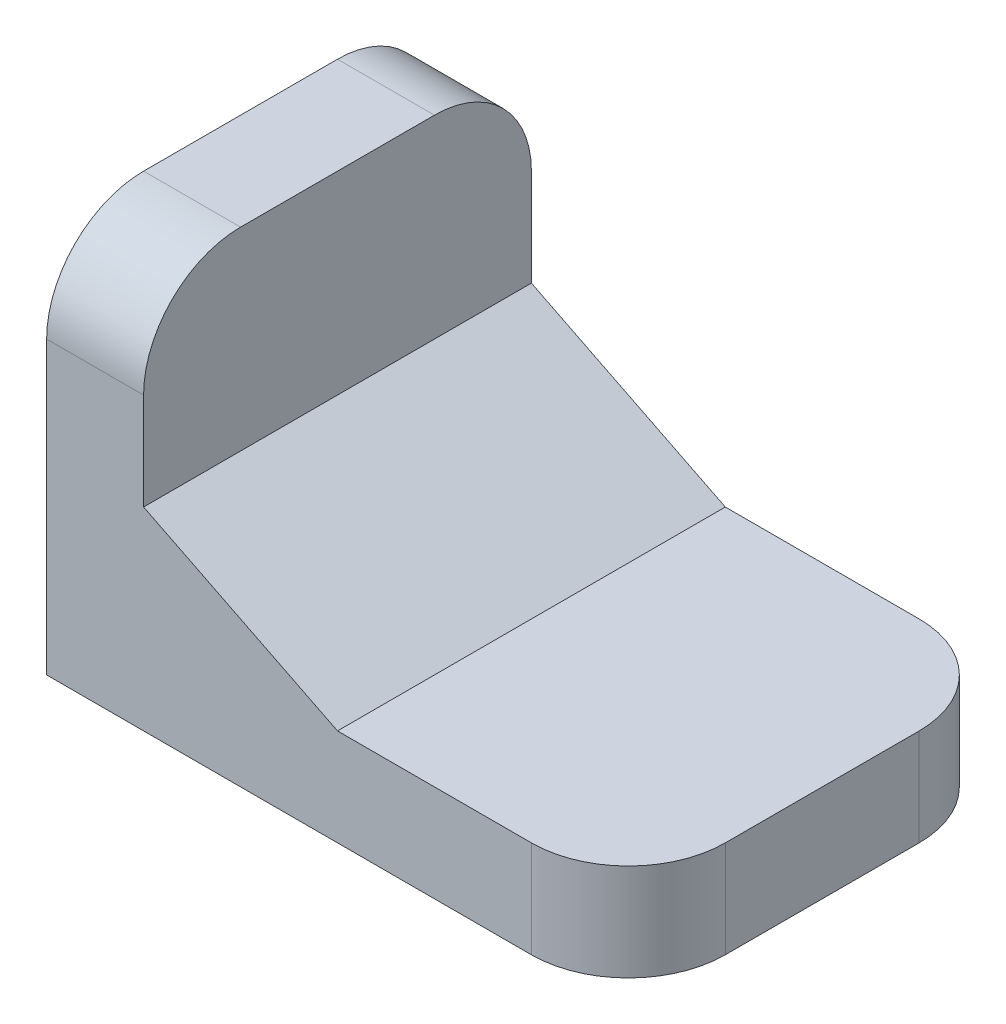
ISO-10303-21;
HEADER;
FILE_DESCRIPTION(('STEP AP214'),'2;1');
FILE_NAME('part.step','',(''),(''),'','','');
FILE_SCHEMA(('AUTOMOTIVE_DESIGN { 1 0 10303 214 1 1 1 1 }'));
ENDSEC;
DATA;
#1=APPLICATION_CONTEXT('core data for automotive mechanical design processes');
#2=APPLICATION_PROTOCOL_DEFINITION('international standard','automotive_design',2000,#1);
#3=PRODUCT_CONTEXT('',#1,'mechanical');
#4=PRODUCT('Part','Part','',(#3));
#5=PRODUCT_RELATED_PRODUCT_CATEGORY('part','',(#4));
#6=PRODUCT_DEFINITION_FORMATION('','',#4);
#7=PRODUCT_DEFINITION_CONTEXT('part definition',#1,'design');
#8=PRODUCT_DEFINITION('design','',#6,#7);
#9=PRODUCT_DEFINITION_SHAPE('','',#8);
#10=(LENGTH_UNIT() NAMED_UNIT(*) SI_UNIT(.MILLI.,.METRE.));
#11=(NAMED_UNIT(*) PLANE_ANGLE_UNIT() SI_UNIT($,.RADIAN.));
#12=(NAMED_UNIT(*) SI_UNIT($,.STERADIAN.) SOLID_ANGLE_UNIT());
#13=UNCERTAINTY_MEASURE_WITH_UNIT(LENGTH_MEASURE(1.E-05),#10,'distance_accuracy_value','');
#14=(GEOMETRIC_REPRESENTATION_CONTEXT(3) GLOBAL_UNCERTAINTY_ASSIGNED_CONTEXT((#13)) GLOBAL_UNIT_ASSIGNED_CONTEXT((#10,
#11,#12)) REPRESENTATION_CONTEXT('',''));
#15=CARTESIAN_POINT('',(0.,0.,0.));
#16=DIRECTION('',(0.,0.,1.));
#17=DIRECTION('',(1.,0.,0.));
#18=AXIS2_PLACEMENT_3D('',#15,#16,#17);
#19=CARTESIAN_POINT('',(0.,0.,20.));
#20=DIRECTION('',(0.,1.,0.));
#21=DIRECTION('',(0.,0.,1.));
#22=AXIS2_PLACEMENT_3D('',#19,#20,#21);
#23=PLANE('',#22);
#24=DIRECTION('',(1.,0.,0.));
#25=VECTOR('',#24,1.);
#26=CARTESIAN_POINT('',(0.,0.,0.));
#27=LINE('',#26,#25);
#28=CARTESIAN_POINT('',(0.,0.,0.));
#29=VERTEX_POINT('',#28);
#30=CARTESIAN_POINT('',(25.,0.,0.));
#31=VERTEX_POINT('',#30);
#32=EDGE_CURVE('E151',#29,#31,#27,.T.);
#33=ORIENTED_EDGE('',*,*,#32,.T.);
#34=CARTESIAN_POINT('',(25.,0.,5.));
#35=DIRECTION('',(0.,1.,0.));
#36=DIRECTION('',(0.,0.,1.));
#37=AXIS2_PLACEMENT_3D('',#34,#35,#36);
#38=CIRCLE('',#37,5.);
#39=CARTESIAN_POINT('',(30.,0.,5.));
#40=VERTEX_POINT('',#39);
#41=EDGE_CURVE('E188',#31,#40,#38,.F.);
#42=ORIENTED_EDGE('',*,*,#41,.T.);
#43=DIRECTION('',(0.,0.,-1.));
#44=VECTOR('',#43,1.);
#45=CARTESIAN_POINT('',(30.,0.,20.));
#46=LINE('',#45,#44);
#47=CARTESIAN_POINT('',(30.,0.,15.));
#48=VERTEX_POINT('',#47);
#49=EDGE_CURVE('E170',#48,#40,#46,.T.);
#50=ORIENTED_EDGE('',*,*,#49,.F.);
#51=CARTESIAN_POINT('',(25.,0.,15.));
#52=DIRECTION('',(0.,1.,0.));
#53=DIRECTION('',(0.,0.,1.));
#54=AXIS2_PLACEMENT_3D('',#51,#52,#53);
#55=CIRCLE('',#54,5.);
#56=CARTESIAN_POINT('',(25.,0.,20.));
#57=VERTEX_POINT('',#56);
#58=EDGE_CURVE('E186',#48,#57,#55,.F.);
#59=ORIENTED_EDGE('',*,*,#58,.T.);
#60=DIRECTION('',(1.,0.,0.));
#61=VECTOR('',#60,1.);
#62=CARTESIAN_POINT('',(0.,0.,20.));
#63=LINE('',#62,#61);
#64=CARTESIAN_POINT('',(0.,0.,20.));
#65=VERTEX_POINT('',#64);
#66=EDGE_CURVE('E127',#65,#57,#63,.T.);
#67=ORIENTED_EDGE('',*,*,#66,.F.);
#68=DIRECTION('',(0.,0.,-1.));
#69=VECTOR('',#68,1.);
#70=CARTESIAN_POINT('',(0.,0.,20.));
#71=LINE('',#70,#69);
#72=EDGE_CURVE('E150',#65,#29,#71,.T.);
#73=ORIENTED_EDGE('',*,*,#72,.T.);
#74=EDGE_LOOP('',(#33,#42,#50,#59,#67,#73));
#75=FACE_BOUND('',#74,.T.);
#76=ADVANCED_FACE('F33',(#75),#23,.F.);
#77=CARTESIAN_POINT('',(30.,0.,20.));
#78=DIRECTION('',(-1.,0.,0.));
#79=DIRECTION('',(0.,0.,1.));
#80=AXIS2_PLACEMENT_3D('',#77,#78,#79);
#81=PLANE('',#80);
#82=ORIENTED_EDGE('',*,*,#49,.T.);
#83=DIRECTION('',(0.,1.,0.));
#84=VECTOR('',#83,1.);
#85=CARTESIAN_POINT('',(30.,0.,5.));
#86=LINE('',#85,#84);
#87=CARTESIAN_POINT('',(30.,5.,5.));
#88=VERTEX_POINT('',#87);
#89=EDGE_CURVE('E175',#40,#88,#86,.T.);
#90=ORIENTED_EDGE('',*,*,#89,.T.);
#91=DIRECTION('',(0.,0.,-1.));
#92=VECTOR('',#91,1.);
#93=CARTESIAN_POINT('',(30.,5.,20.));
#94=LINE('',#93,#92);
#95=CARTESIAN_POINT('',(30.,5.,15.));
#96=VERTEX_POINT('',#95);
#97=EDGE_CURVE('E137',#96,#88,#94,.T.);
#98=ORIENTED_EDGE('',*,*,#97,.F.);
#99=DIRECTION('',(0.,1.,0.));
#100=VECTOR('',#99,1.);
#101=CARTESIAN_POINT('',(30.,0.,15.));
#102=LINE('',#101,#100);
#103=EDGE_CURVE('E173',#96,#48,#102,.F.);
#104=ORIENTED_EDGE('',*,*,#103,.T.);
#105=EDGE_LOOP('',(#82,#90,#98,#104));
#106=FACE_BOUND('',#105,.T.);
#107=ADVANCED_FACE('F229',(#106),#81,.F.);
#108=CARTESIAN_POINT('',(15.,5.,20.));
#109=DIRECTION('',(0.,-1.,0.));
#110=DIRECTION('',(0.,0.,-1.));
#111=AXIS2_PLACEMENT_3D('',#108,#109,#110);
#112=PLANE('',#111);
#113=ORIENTED_EDGE('',*,*,#97,.T.);
#114=CARTESIAN_POINT('',(25.,5.,5.));
#115=DIRECTION('',(0.,-1.,0.));
#116=DIRECTION('',(0.,0.,-1.));
#117=AXIS2_PLACEMENT_3D('',#114,#115,#116);
#118=CIRCLE('',#117,5.);
#119=CARTESIAN_POINT('',(25.,5.,0.));
#120=VERTEX_POINT('',#119);
#121=EDGE_CURVE('E180',#88,#120,#118,.F.);
#122=ORIENTED_EDGE('',*,*,#121,.T.);
#123=DIRECTION('',(-1.,0.,0.));
#124=VECTOR('',#123,1.);
#125=CARTESIAN_POINT('',(15.,5.,0.));
#126=LINE('',#125,#124);
#127=CARTESIAN_POINT('',(15.,5.,0.));
#128=VERTEX_POINT('',#127);
#129=EDGE_CURVE('E134',#120,#128,#126,.T.);
#130=ORIENTED_EDGE('',*,*,#129,.T.);
#131=DIRECTION('',(0.,0.,-1.));
#132=VECTOR('',#131,1.);
#133=CARTESIAN_POINT('',(15.,5.,20.));
#134=LINE('',#133,#132);
#135=CARTESIAN_POINT('',(15.,5.,20.));
#136=VERTEX_POINT('',#135);
#137=EDGE_CURVE('E130',#136,#128,#134,.T.);
#138=ORIENTED_EDGE('',*,*,#137,.F.);
#139=DIRECTION('',(-1.,0.,0.));
#140=VECTOR('',#139,1.);
#141=CARTESIAN_POINT('',(15.,5.,20.));
#142=LINE('',#141,#140);
#143=CARTESIAN_POINT('',(25.,5.,20.));
#144=VERTEX_POINT('',#143);
#145=EDGE_CURVE('E116',#144,#136,#142,.T.);
#146=ORIENTED_EDGE('',*,*,#145,.F.);
#147=CARTESIAN_POINT('',(25.,5.,15.));
#148=DIRECTION('',(0.,-1.,0.));
#149=DIRECTION('',(0.,0.,-1.));
#150=AXIS2_PLACEMENT_3D('',#147,#148,#149);
#151=CIRCLE('',#150,5.);
#152=EDGE_CURVE('E178',#144,#96,#151,.F.);
#153=ORIENTED_EDGE('',*,*,#152,.T.);
#154=EDGE_LOOP('',(#113,#122,#130,#138,#146,#153));
#155=FACE_BOUND('',#154,.T.);
#156=ADVANCED_FACE('F132',(#155),#112,.F.);
#157=CARTESIAN_POINT('',(5.,10.,20.));
#158=DIRECTION('',(-0.447213595499958,-0.894427190999916,0.));
#159=DIRECTION('',(0.894427190999916,-0.447213595499958,0.));
#160=AXIS2_PLACEMENT_3D('',#157,#158,#159);
#161=PLANE('',#160);
#162=DIRECTION('',(-0.894427190999916,0.447213595499958,0.));
#163=VECTOR('',#162,1.);
#164=CARTESIAN_POINT('',(5.,10.,0.));
#165=LINE('',#164,#163);
#166=CARTESIAN_POINT('',(5.,10.,0.));
#167=VERTEX_POINT('',#166);
#168=EDGE_CURVE('E155',#128,#167,#165,.T.);
#169=ORIENTED_EDGE('',*,*,#168,.T.);
#170=DIRECTION('',(0.,0.,-1.));
#171=VECTOR('',#170,1.);
#172=CARTESIAN_POINT('',(5.,10.,20.));
#173=LINE('',#172,#171);
#174=CARTESIAN_POINT('',(5.,10.,20.));
#175=VERTEX_POINT('',#174);
#176=EDGE_CURVE('E138',#175,#167,#173,.T.);
#177=ORIENTED_EDGE('',*,*,#176,.F.);
#178=DIRECTION('',(-0.894427190999916,0.447213595499958,0.));
#179=VECTOR('',#178,1.);
#180=CARTESIAN_POINT('',(5.,10.,20.));
#181=LINE('',#180,#179);
#182=EDGE_CURVE('E121',#136,#175,#181,.T.);
#183=ORIENTED_EDGE('',*,*,#182,.F.);
#184=ORIENTED_EDGE('',*,*,#137,.T.);
#185=EDGE_LOOP('',(#169,#177,#183,#184));
#186=FACE_BOUND('',#185,.T.);
#187=ADVANCED_FACE('F140',(#186),#161,.F.);
#188=CARTESIAN_POINT('',(5.,10.,20.));
#189=DIRECTION('',(-1.,0.,0.));
#190=DIRECTION('',(0.,0.,1.));
#191=AXIS2_PLACEMENT_3D('',#188,#189,#190);
#192=PLANE('',#191);
#193=DIRECTION('',(0.,0.,-1.));
#194=VECTOR('',#193,1.);
#195=CARTESIAN_POINT('',(5.,20.,20.));
#196=LINE('',#195,#194);
#197=CARTESIAN_POINT('',(5.,20.,15.));
#198=VERTEX_POINT('',#197);
#199=CARTESIAN_POINT('',(5.,20.,5.));
#200=VERTEX_POINT('',#199);
#201=EDGE_CURVE('E166',#198,#200,#196,.T.);
#202=ORIENTED_EDGE('',*,*,#201,.F.);
#203=CARTESIAN_POINT('',(5.,15.,15.));
#204=DIRECTION('',(-1.,0.,0.));
#205=DIRECTION('',(0.,0.,1.));
#206=AXIS2_PLACEMENT_3D('',#203,#204,#205);
#207=CIRCLE('',#206,5.);
#208=CARTESIAN_POINT('',(5.,15.,20.));
#209=VERTEX_POINT('',#208);
#210=EDGE_CURVE('E11',#198,#209,#207,.F.);
#211=ORIENTED_EDGE('',*,*,#210,.T.);
#212=DIRECTION('',(0.,1.,0.));
#213=VECTOR('',#212,1.);
#214=CARTESIAN_POINT('',(5.,10.,20.));
#215=LINE('',#214,#213);
#216=EDGE_CURVE('E143',#175,#209,#215,.T.);
#217=ORIENTED_EDGE('',*,*,#216,.F.);
#218=ORIENTED_EDGE('',*,*,#176,.T.);
#219=DIRECTION('',(0.,1.,0.));
#220=VECTOR('',#219,1.);
#221=CARTESIAN_POINT('',(5.,10.,0.));
#222=LINE('',#221,#220);
#223=CARTESIAN_POINT('',(5.,15.,0.));
#224=VERTEX_POINT('',#223);
#225=EDGE_CURVE('E157',#167,#224,#222,.T.);
#226=ORIENTED_EDGE('',*,*,#225,.T.);
#227=CARTESIAN_POINT('',(5.,15.,5.));
#228=DIRECTION('',(-1.,0.,0.));
#229=DIRECTION('',(0.,0.,1.));
#230=AXIS2_PLACEMENT_3D('',#227,#228,#229);
#231=CIRCLE('',#230,5.);
#232=EDGE_CURVE('E41',#224,#200,#231,.F.);
#233=ORIENTED_EDGE('',*,*,#232,.T.);
#234=EDGE_LOOP('',(#202,#211,#217,#218,#226,#233));
#235=FACE_BOUND('',#234,.T.);
#236=ADVANCED_FACE('F213',(#235),#192,.F.);
#237=CARTESIAN_POINT('',(0.,20.,20.));
#238=DIRECTION('',(0.,-1.,0.));
#239=DIRECTION('',(0.,0.,-1.));
#240=AXIS2_PLACEMENT_3D('',#237,#238,#239);
#241=PLANE('',#240);
#242=DIRECTION('',(0.,0.,-1.));
#243=VECTOR('',#242,1.);
#244=CARTESIAN_POINT('',(0.,20.,20.));
#245=LINE('',#244,#243);
#246=CARTESIAN_POINT('',(0.,20.,15.));
#247=VERTEX_POINT('',#246);
#248=CARTESIAN_POINT('',(0.,20.,5.));
#249=VERTEX_POINT('',#248);
#250=EDGE_CURVE('E163',#247,#249,#245,.T.);
#251=ORIENTED_EDGE('',*,*,#250,.F.);
#252=DIRECTION('',(-1.,0.,0.));
#253=VECTOR('',#252,1.);
#254=CARTESIAN_POINT('',(5.,20.,15.));
#255=LINE('',#254,#253);
#256=EDGE_CURVE('E54',#247,#198,#255,.F.);
#257=ORIENTED_EDGE('',*,*,#256,.T.);
#258=ORIENTED_EDGE('',*,*,#201,.T.);
#259=DIRECTION('',(-1.,0.,0.));
#260=VECTOR('',#259,1.);
#261=CARTESIAN_POINT('',(0.,20.,5.));
#262=LINE('',#261,#260);
#263=EDGE_CURVE('E198',#200,#249,#262,.T.);
#264=ORIENTED_EDGE('',*,*,#263,.T.);
#265=EDGE_LOOP('',(#251,#257,#258,#264));
#266=FACE_BOUND('',#265,.T.);
#267=ADVANCED_FACE('F202',(#266),#241,.F.);
#268=CARTESIAN_POINT('',(0.,0.,20.));
#269=DIRECTION('',(1.,0.,0.));
#270=DIRECTION('',(0.,0.,-1.));
#271=AXIS2_PLACEMENT_3D('',#268,#269,#270);
#272=PLANE('',#271);
#273=DIRECTION('',(0.,-1.,0.));
#274=VECTOR('',#273,1.);
#275=CARTESIAN_POINT('',(0.,0.,20.));
#276=LINE('',#275,#274);
#277=CARTESIAN_POINT('',(0.,15.,20.));
#278=VERTEX_POINT('',#277);
#279=EDGE_CURVE('E145',#278,#65,#276,.T.);
#280=ORIENTED_EDGE('',*,*,#279,.F.);
#281=CARTESIAN_POINT('',(0.,15.,15.));
#282=DIRECTION('',(1.,0.,0.));
#283=DIRECTION('',(0.,0.,-1.));
#284=AXIS2_PLACEMENT_3D('',#281,#282,#283);
#285=CIRCLE('',#284,5.);
#286=EDGE_CURVE('E196',#278,#247,#285,.F.);
#287=ORIENTED_EDGE('',*,*,#286,.T.);
#288=ORIENTED_EDGE('',*,*,#250,.T.);
#289=CARTESIAN_POINT('',(0.,15.,5.));
#290=DIRECTION('',(1.,0.,0.));
#291=DIRECTION('',(0.,0.,-1.));
#292=AXIS2_PLACEMENT_3D('',#289,#290,#291);
#293=CIRCLE('',#292,5.);
#294=CARTESIAN_POINT('',(0.,15.,0.));
#295=VERTEX_POINT('',#294);
#296=EDGE_CURVE('E194',#249,#295,#293,.F.);
#297=ORIENTED_EDGE('',*,*,#296,.T.);
#298=DIRECTION('',(0.,-1.,0.));
#299=VECTOR('',#298,1.);
#300=CARTESIAN_POINT('',(0.,0.,0.));
#301=LINE('',#300,#299);
#302=EDGE_CURVE('E159',#295,#29,#301,.T.);
#303=ORIENTED_EDGE('',*,*,#302,.T.);
#304=ORIENTED_EDGE('',*,*,#72,.F.);
#305=EDGE_LOOP('',(#280,#287,#288,#297,#303,#304));
#306=FACE_BOUND('',#305,.T.);
#307=ADVANCED_FACE('F206',(#306),#272,.F.);
#308=CARTESIAN_POINT('',(0.,0.,20.));
#309=DIRECTION('',(0.,0.,1.));
#310=DIRECTION('',(1.,0.,0.));
#311=AXIS2_PLACEMENT_3D('',#308,#309,#310);
#312=PLANE('',#311);
#313=ORIENTED_EDGE('',*,*,#216,.T.);
#314=DIRECTION('',(-1.,0.,0.));
#315=VECTOR('',#314,1.);
#316=CARTESIAN_POINT('',(0.,15.,20.));
#317=LINE('',#316,#315);
#318=EDGE_CURVE('E191',#209,#278,#317,.T.);
#319=ORIENTED_EDGE('',*,*,#318,.T.);
#320=ORIENTED_EDGE('',*,*,#279,.T.);
#321=ORIENTED_EDGE('',*,*,#66,.T.);
#322=DIRECTION('',(0.,1.,0.));
#323=VECTOR('',#322,1.);
#324=CARTESIAN_POINT('',(25.,5.,20.));
#325=LINE('',#324,#323);
#326=EDGE_CURVE('E125',#57,#144,#325,.T.);
#327=ORIENTED_EDGE('',*,*,#326,.T.);
#328=ORIENTED_EDGE('',*,*,#145,.T.);
#329=ORIENTED_EDGE('',*,*,#182,.T.);
#330=EDGE_LOOP('',(#313,#319,#320,#321,#327,#328,#329));
#331=FACE_BOUND('',#330,.T.);
#332=ADVANCED_FACE('F119',(#331),#312,.T.);
#333=CARTESIAN_POINT('',(0.,0.,0.));
#334=DIRECTION('',(0.,0.,1.));
#335=DIRECTION('',(1.,0.,0.));
#336=AXIS2_PLACEMENT_3D('',#333,#334,#335);
#337=PLANE('',#336);
#338=ORIENTED_EDGE('',*,*,#129,.F.);
#339=DIRECTION('',(0.,1.,0.));
#340=VECTOR('',#339,1.);
#341=CARTESIAN_POINT('',(25.,0.,0.));
#342=LINE('',#341,#340);
#343=EDGE_CURVE('E184',#120,#31,#342,.F.);
#344=ORIENTED_EDGE('',*,*,#343,.T.);
#345=ORIENTED_EDGE('',*,*,#32,.F.);
#346=ORIENTED_EDGE('',*,*,#302,.F.);
#347=DIRECTION('',(-1.,0.,0.));
#348=VECTOR('',#347,1.);
#349=CARTESIAN_POINT('',(0.,15.,0.));
#350=LINE('',#349,#348);
#351=EDGE_CURVE('E182',#295,#224,#350,.F.);
#352=ORIENTED_EDGE('',*,*,#351,.T.);
#353=ORIENTED_EDGE('',*,*,#225,.F.);
#354=ORIENTED_EDGE('',*,*,#168,.F.);
#355=EDGE_LOOP('',(#338,#344,#345,#346,#352,#353,#354));
#356=FACE_BOUND('',#355,.T.);
#357=ADVANCED_FACE('F216',(#356),#337,.F.);
#358=CARTESIAN_POINT('',(25.,0.,5.));
#359=DIRECTION('',(0.,1.,0.));
#360=DIRECTION('',(0.,0.,1.));
#361=AXIS2_PLACEMENT_3D('',#358,#359,#360);
#362=CYLINDRICAL_SURFACE('',#361,5.);
#363=ORIENTED_EDGE('',*,*,#41,.F.);
#364=ORIENTED_EDGE('',*,*,#343,.F.);
#365=ORIENTED_EDGE('',*,*,#121,.F.);
#366=ORIENTED_EDGE('',*,*,#89,.F.);
#367=EDGE_LOOP('',(#363,#364,#365,#366));
#368=FACE_BOUND('',#367,.T.);
#369=ADVANCED_FACE('F226',(#368),#362,.T.);
#370=CARTESIAN_POINT('',(0.,15.,15.));
#371=DIRECTION('',(1.,0.,0.));
#372=DIRECTION('',(0.,0.,-1.));
#373=AXIS2_PLACEMENT_3D('',#370,#371,#372);
#374=CYLINDRICAL_SURFACE('',#373,5.);
#375=ORIENTED_EDGE('',*,*,#210,.F.);
#376=ORIENTED_EDGE('',*,*,#256,.F.);
#377=ORIENTED_EDGE('',*,*,#286,.F.);
#378=ORIENTED_EDGE('',*,*,#318,.F.);
#379=EDGE_LOOP('',(#375,#376,#377,#378));
#380=FACE_BOUND('',#379,.T.);
#381=ADVANCED_FACE('F212',(#380),#374,.T.);
#382=CARTESIAN_POINT('',(0.,15.,5.));
#383=DIRECTION('',(-1.,0.,0.));
#384=DIRECTION('',(0.,0.,1.));
#385=AXIS2_PLACEMENT_3D('',#382,#383,#384);
#386=CYLINDRICAL_SURFACE('',#385,5.);
#387=ORIENTED_EDGE('',*,*,#232,.F.);
#388=ORIENTED_EDGE('',*,*,#351,.F.);
#389=ORIENTED_EDGE('',*,*,#296,.F.);
#390=ORIENTED_EDGE('',*,*,#263,.F.);
#391=EDGE_LOOP('',(#387,#388,#389,#390));
#392=FACE_BOUND('',#391,.T.);
#393=ADVANCED_FACE('F219',(#392),#386,.T.);
#394=CARTESIAN_POINT('',(25.,0.,15.));
#395=DIRECTION('',(0.,-1.,0.));
#396=DIRECTION('',(0.,0.,-1.));
#397=AXIS2_PLACEMENT_3D('',#394,#395,#396);
#398=CYLINDRICAL_SURFACE('',#397,5.);
#399=ORIENTED_EDGE('',*,*,#58,.F.);
#400=ORIENTED_EDGE('',*,*,#103,.F.);
#401=ORIENTED_EDGE('',*,*,#152,.F.);
#402=ORIENTED_EDGE('',*,*,#326,.F.);
#403=EDGE_LOOP('',(#399,#400,#401,#402));
#404=FACE_BOUND('',#403,.T.);
#405=ADVANCED_FACE('F35',(#404),#398,.T.);
#406=CLOSED_SHELL('',(#76,#107,#156,#187,#236,#267,#307,#332,#357,#369,#381,#393,#405));
#407=MANIFOLD_SOLID_BREP('B2',#406);
#408=ADVANCED_BREP_SHAPE_REPRESENTATION('',(#18,#407),#14);
#409=SHAPE_DEFINITION_REPRESENTATION(#9,#408);
ENDSEC;
END-ISO-10303-21;
